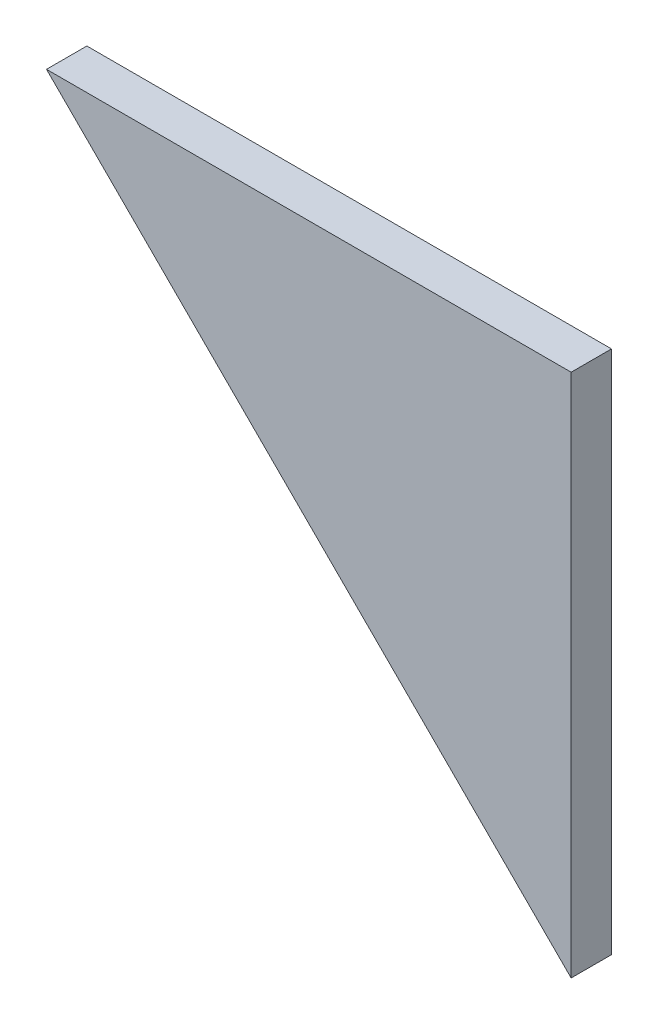
ISO-10303-21;
HEADER;
FILE_DESCRIPTION(('STEP AP214'),'2;1');
FILE_NAME('part.step','',(''),(''),'','','');
FILE_SCHEMA(('AUTOMOTIVE_DESIGN { 1 0 10303 214 1 1 1 1 }'));
ENDSEC;
DATA;
#1=APPLICATION_CONTEXT('core data for automotive mechanical design processes');
#2=APPLICATION_PROTOCOL_DEFINITION('international standard','automotive_design',2000,#1);
#3=PRODUCT_CONTEXT('',#1,'mechanical');
#4=PRODUCT('Part','Part','',(#3));
#5=PRODUCT_RELATED_PRODUCT_CATEGORY('part','',(#4));
#6=PRODUCT_DEFINITION_FORMATION('','',#4);
#7=PRODUCT_DEFINITION_CONTEXT('part definition',#1,'design');
#8=PRODUCT_DEFINITION('design','',#6,#7);
#9=PRODUCT_DEFINITION_SHAPE('','',#8);
#10=(LENGTH_UNIT() NAMED_UNIT(*) SI_UNIT(.MILLI.,.METRE.));
#11=(NAMED_UNIT(*) PLANE_ANGLE_UNIT() SI_UNIT($,.RADIAN.));
#12=(NAMED_UNIT(*) SI_UNIT($,.STERADIAN.) SOLID_ANGLE_UNIT());
#13=UNCERTAINTY_MEASURE_WITH_UNIT(LENGTH_MEASURE(1.E-05),#10,'distance_accuracy_value','');
#14=(GEOMETRIC_REPRESENTATION_CONTEXT(3) GLOBAL_UNCERTAINTY_ASSIGNED_CONTEXT((#13)) GLOBAL_UNIT_ASSIGNED_CONTEXT((#10,
#11,#12)) REPRESENTATION_CONTEXT('',''));
#15=CARTESIAN_POINT('',(0.,0.,0.));
#16=DIRECTION('',(0.,0.,1.));
#17=DIRECTION('',(1.,0.,0.));
#18=AXIS2_PLACEMENT_3D('',#15,#16,#17);
#19=CARTESIAN_POINT('',(964.999999999998,-143.5,-2.));
#20=DIRECTION('',(1.,0.,0.));
#21=DIRECTION('',(0.,0.,-1.));
#22=AXIS2_PLACEMENT_3D('',#19,#20,#21);
#23=PLANE('',#22);
#24=DIRECTION('',(0.,1.,0.));
#25=VECTOR('',#24,1.);
#26=CARTESIAN_POINT('',(964.999999999998,-143.5,0.));
#27=LINE('',#26,#25);
#28=CARTESIAN_POINT('',(964.999999999998,-169.5,0.));
#29=VERTEX_POINT('',#28);
#30=CARTESIAN_POINT('',(964.999999999998,-143.5,0.));
#31=VERTEX_POINT('',#30);
#32=EDGE_CURVE('E84',#29,#31,#27,.T.);
#33=ORIENTED_EDGE('',*,*,#32,.F.);
#34=DIRECTION('',(0.,0.,1.));
#35=VECTOR('',#34,1.);
#36=CARTESIAN_POINT('',(964.999999999998,-169.5,-2.));
#37=LINE('',#36,#35);
#38=CARTESIAN_POINT('',(964.999999999998,-169.5,-2.));
#39=VERTEX_POINT('',#38);
#40=EDGE_CURVE('E11',#39,#29,#37,.T.);
#41=ORIENTED_EDGE('',*,*,#40,.F.);
#42=DIRECTION('',(0.,1.,0.));
#43=VECTOR('',#42,1.);
#44=CARTESIAN_POINT('',(964.999999999998,-143.5,-2.));
#45=LINE('',#44,#43);
#46=CARTESIAN_POINT('',(964.999999999998,-143.5,-2.));
#47=VERTEX_POINT('',#46);
#48=EDGE_CURVE('E76',#39,#47,#45,.T.);
#49=ORIENTED_EDGE('',*,*,#48,.T.);
#50=DIRECTION('',(0.,0.,1.));
#51=VECTOR('',#50,1.);
#52=CARTESIAN_POINT('',(964.999999999998,-143.5,-2.));
#53=LINE('',#52,#51);
#54=EDGE_CURVE('E35',#47,#31,#53,.T.);
#55=ORIENTED_EDGE('',*,*,#54,.T.);
#56=EDGE_LOOP('',(#33,#41,#49,#55));
#57=FACE_BOUND('',#56,.T.);
#58=ADVANCED_FACE('F32',(#57),#23,.T.);
#59=CARTESIAN_POINT('',(964.999999999998,-169.5,-2.));
#60=DIRECTION('',(-0.707106781186556,-0.707106781186539,0.));
#61=DIRECTION('',(0.707106781186539,-0.707106781186556,0.));
#62=AXIS2_PLACEMENT_3D('',#59,#60,#61);
#63=PLANE('',#62);
#64=DIRECTION('',(0.707106781186539,-0.707106781186556,0.));
#65=VECTOR('',#64,1.);
#66=CARTESIAN_POINT('',(964.999999999998,-169.5,0.));
#67=LINE('',#66,#65);
#68=CARTESIAN_POINT('',(938.999999999998,-143.5,0.));
#69=VERTEX_POINT('',#68);
#70=EDGE_CURVE('E78',#69,#29,#67,.T.);
#71=ORIENTED_EDGE('',*,*,#70,.F.);
#72=DIRECTION('',(0.,0.,1.));
#73=VECTOR('',#72,1.);
#74=CARTESIAN_POINT('',(938.999999999998,-143.5,-2.));
#75=LINE('',#74,#73);
#76=CARTESIAN_POINT('',(938.999999999998,-143.5,-2.));
#77=VERTEX_POINT('',#76);
#78=EDGE_CURVE('E41',#77,#69,#75,.T.);
#79=ORIENTED_EDGE('',*,*,#78,.F.);
#80=DIRECTION('',(0.707106781186539,-0.707106781186556,0.));
#81=VECTOR('',#80,1.);
#82=CARTESIAN_POINT('',(964.999999999998,-169.5,-2.));
#83=LINE('',#82,#81);
#84=EDGE_CURVE('E73',#77,#39,#83,.T.);
#85=ORIENTED_EDGE('',*,*,#84,.T.);
#86=ORIENTED_EDGE('',*,*,#40,.T.);
#87=EDGE_LOOP('',(#71,#79,#85,#86));
#88=FACE_BOUND('',#87,.T.);
#89=ADVANCED_FACE('F88',(#88),#63,.T.);
#90=CARTESIAN_POINT('',(938.999999999998,-143.5,-2.));
#91=DIRECTION('',(0.,1.,0.));
#92=DIRECTION('',(-1.,0.,0.));
#93=AXIS2_PLACEMENT_3D('',#90,#91,#92);
#94=PLANE('',#93);
#95=DIRECTION('',(-1.,0.,0.));
#96=VECTOR('',#95,1.);
#97=CARTESIAN_POINT('',(938.999999999998,-143.5,0.));
#98=LINE('',#97,#96);
#99=EDGE_CURVE('E71',#31,#69,#98,.T.);
#100=ORIENTED_EDGE('',*,*,#99,.F.);
#101=ORIENTED_EDGE('',*,*,#54,.F.);
#102=DIRECTION('',(-1.,0.,0.));
#103=VECTOR('',#102,1.);
#104=CARTESIAN_POINT('',(938.999999999998,-143.5,-2.));
#105=LINE('',#104,#103);
#106=EDGE_CURVE('E69',#47,#77,#105,.T.);
#107=ORIENTED_EDGE('',*,*,#106,.T.);
#108=ORIENTED_EDGE('',*,*,#78,.T.);
#109=EDGE_LOOP('',(#100,#101,#107,#108));
#110=FACE_BOUND('',#109,.T.);
#111=ADVANCED_FACE('F68',(#110),#94,.T.);
#112=CARTESIAN_POINT('',(0.,0.,-2.));
#113=DIRECTION('',(0.,0.,1.));
#114=DIRECTION('',(1.,0.,0.));
#115=AXIS2_PLACEMENT_3D('',#112,#113,#114);
#116=PLANE('',#115);
#117=ORIENTED_EDGE('',*,*,#48,.F.);
#118=ORIENTED_EDGE('',*,*,#84,.F.);
#119=ORIENTED_EDGE('',*,*,#106,.F.);
#120=EDGE_LOOP('',(#117,#118,#119));
#121=FACE_BOUND('',#120,.T.);
#122=ADVANCED_FACE('F75',(#121),#116,.F.);
#123=CARTESIAN_POINT('',(0.,0.,0.));
#124=DIRECTION('',(0.,0.,1.));
#125=DIRECTION('',(1.,0.,0.));
#126=AXIS2_PLACEMENT_3D('',#123,#124,#125);
#127=PLANE('',#126);
#128=ORIENTED_EDGE('',*,*,#32,.T.);
#129=ORIENTED_EDGE('',*,*,#99,.T.);
#130=ORIENTED_EDGE('',*,*,#70,.T.);
#131=EDGE_LOOP('',(#128,#129,#130));
#132=FACE_BOUND('',#131,.T.);
#133=ADVANCED_FACE('F87',(#132),#127,.T.);
#134=CLOSED_SHELL('',(#58,#89,#111,#122,#133));
#135=MANIFOLD_SOLID_BREP('B2',#134);
#136=ADVANCED_BREP_SHAPE_REPRESENTATION('',(#18,#135),#14);
#137=SHAPE_DEFINITION_REPRESENTATION(#9,#136);
ENDSEC;
END-ISO-10303-21;
